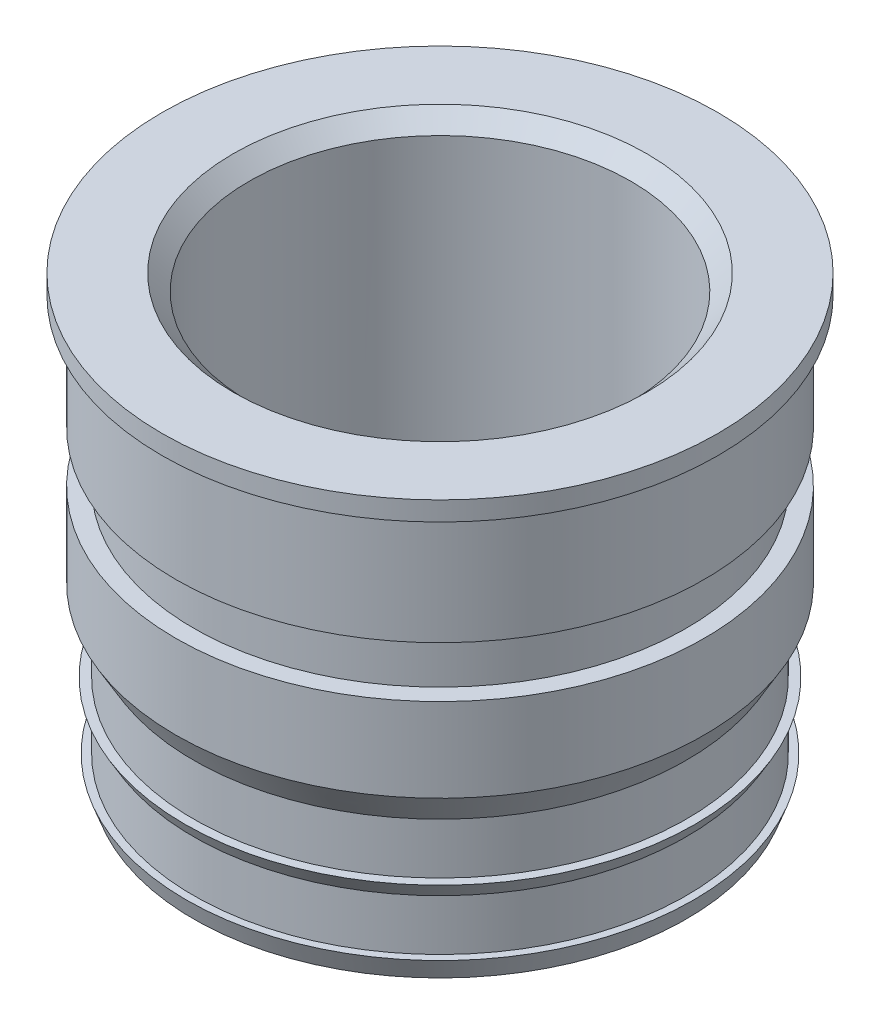
ISO-10303-21;
HEADER;
FILE_DESCRIPTION(('STEP AP214'),'2;1');
FILE_NAME('part.step','',(''),(''),'','','');
FILE_SCHEMA(('AUTOMOTIVE_DESIGN { 1 0 10303 214 1 1 1 1 }'));
ENDSEC;
DATA;
#1=APPLICATION_CONTEXT('core data for automotive mechanical design processes');
#2=APPLICATION_PROTOCOL_DEFINITION('international standard','automotive_design',2000,#1);
#3=PRODUCT_CONTEXT('',#1,'mechanical');
#4=PRODUCT('Part','Part','',(#3));
#5=PRODUCT_RELATED_PRODUCT_CATEGORY('part','',(#4));
#6=PRODUCT_DEFINITION_FORMATION('','',#4);
#7=PRODUCT_DEFINITION_CONTEXT('part definition',#1,'design');
#8=PRODUCT_DEFINITION('design','',#6,#7);
#9=PRODUCT_DEFINITION_SHAPE('','',#8);
#10=(LENGTH_UNIT() NAMED_UNIT(*) SI_UNIT(.MILLI.,.METRE.));
#11=(NAMED_UNIT(*) PLANE_ANGLE_UNIT() SI_UNIT($,.RADIAN.));
#12=(NAMED_UNIT(*) SI_UNIT($,.STERADIAN.) SOLID_ANGLE_UNIT());
#13=UNCERTAINTY_MEASURE_WITH_UNIT(LENGTH_MEASURE(1.E-05),#10,'distance_accuracy_value','');
#14=(GEOMETRIC_REPRESENTATION_CONTEXT(3) GLOBAL_UNCERTAINTY_ASSIGNED_CONTEXT((#13)) GLOBAL_UNIT_ASSIGNED_CONTEXT((#10,
#11,#12)) REPRESENTATION_CONTEXT('',''));
#15=CARTESIAN_POINT('',(0.,0.,0.));
#16=DIRECTION('',(0.,0.,1.));
#17=DIRECTION('',(1.,0.,0.));
#18=AXIS2_PLACEMENT_3D('',#15,#16,#17);
#19=CARTESIAN_POINT('',(0.,1.715,2.185));
#20=DIRECTION('',(0.,-1.,0.));
#21=DIRECTION('',(0.,0.,-1.));
#22=AXIS2_PLACEMENT_3D('',#19,#20,#21);
#23=PLANE('',#22);
#24=CARTESIAN_POINT('',(0.,1.715,0.));
#25=DIRECTION('',(0.,-1.,0.));
#26=DIRECTION('',(0.,0.,-1.));
#27=AXIS2_PLACEMENT_3D('',#24,#25,#26);
#28=CIRCLE('',#27,1.625);
#29=CARTESIAN_POINT('',(0.,1.715,-1.625));
#30=VERTEX_POINT('',#29);
#31=EDGE_CURVE('E10',#30,#30,#28,.T.);
#32=ORIENTED_EDGE('',*,*,#31,.T.);
#33=EDGE_LOOP('',(#32));
#34=FACE_BOUND('',#33,.T.);
#35=CARTESIAN_POINT('',(0.,1.715,0.));
#36=DIRECTION('',(0.,-1.,0.));
#37=DIRECTION('',(0.,0.,-1.));
#38=AXIS2_PLACEMENT_3D('',#35,#36,#37);
#39=CIRCLE('',#38,2.185);
#40=CARTESIAN_POINT('',(0.,1.715,-2.185));
#41=VERTEX_POINT('',#40);
#42=EDGE_CURVE('E112',#41,#41,#39,.T.);
#43=ORIENTED_EDGE('',*,*,#42,.F.);
#44=EDGE_LOOP('',(#43));
#45=FACE_BOUND('',#44,.T.);
#46=ADVANCED_FACE('F50',(#34,#45),#23,.F.);
#47=CARTESIAN_POINT('',(0.,-1.715,0.));
#48=DIRECTION('',(0.,-1.,0.));
#49=DIRECTION('',(0.,0.,-1.));
#50=AXIS2_PLACEMENT_3D('',#47,#48,#49);
#51=CYLINDRICAL_SURFACE('',#50,1.5);
#52=CARTESIAN_POINT('',(0.,-1.59,0.));
#53=DIRECTION('',(0.,1.,0.));
#54=DIRECTION('',(0.,0.,1.));
#55=AXIS2_PLACEMENT_3D('',#52,#53,#54);
#56=CIRCLE('',#55,1.5);
#57=CARTESIAN_POINT('',(0.,-1.59,1.5));
#58=VERTEX_POINT('',#57);
#59=EDGE_CURVE('E59',#58,#58,#56,.F.);
#60=ORIENTED_EDGE('',*,*,#59,.T.);
#61=EDGE_LOOP('',(#60));
#62=FACE_BOUND('',#61,.T.);
#63=CARTESIAN_POINT('',(0.,1.59,0.));
#64=DIRECTION('',(0.,-1.,0.));
#65=DIRECTION('',(0.,0.,-1.));
#66=AXIS2_PLACEMENT_3D('',#63,#64,#65);
#67=CIRCLE('',#66,1.5);
#68=CARTESIAN_POINT('',(0.,1.59,-1.5));
#69=VERTEX_POINT('',#68);
#70=EDGE_CURVE('E61',#69,#69,#67,.F.);
#71=ORIENTED_EDGE('',*,*,#70,.T.);
#72=EDGE_LOOP('',(#71));
#73=FACE_BOUND('',#72,.T.);
#74=ADVANCED_FACE('F125',(#62,#73),#51,.F.);
#75=CARTESIAN_POINT('',(0.,-1.715,1.5));
#76=DIRECTION('',(0.,1.,0.));
#77=DIRECTION('',(0.,0.,1.));
#78=AXIS2_PLACEMENT_3D('',#75,#76,#77);
#79=PLANE('',#78);
#80=CARTESIAN_POINT('',(0.,-1.715,0.));
#81=DIRECTION('',(0.,1.,0.));
#82=DIRECTION('',(0.,0.,1.));
#83=AXIS2_PLACEMENT_3D('',#80,#81,#82);
#84=CIRCLE('',#83,1.625);
#85=CARTESIAN_POINT('',(0.,-1.715,1.625));
#86=VERTEX_POINT('',#85);
#87=EDGE_CURVE('E53',#86,#86,#84,.T.);
#88=ORIENTED_EDGE('',*,*,#87,.T.);
#89=EDGE_LOOP('',(#88));
#90=FACE_BOUND('',#89,.T.);
#91=CARTESIAN_POINT('',(0.,-1.715,0.));
#92=DIRECTION('',(0.,-1.,0.));
#93=DIRECTION('',(0.,0.,-1.));
#94=AXIS2_PLACEMENT_3D('',#91,#92,#93);
#95=CIRCLE('',#94,1.9368932038835);
#96=CARTESIAN_POINT('',(0.,-1.715,-1.9368932038835));
#97=VERTEX_POINT('',#96);
#98=EDGE_CURVE('E70',#97,#97,#95,.T.);
#99=ORIENTED_EDGE('',*,*,#98,.T.);
#100=EDGE_LOOP('',(#99));
#101=FACE_BOUND('',#100,.T.);
#102=ADVANCED_FACE('F128',(#90,#101),#79,.F.);
#103=CARTESIAN_POINT('',(0.,-1.55535288975305,0.));
#104=DIRECTION('',(0.,1.,0.));
#105=DIRECTION('',(0.,0.,1.));
#106=AXIS2_PLACEMENT_3D('',#103,#104,#105);
#107=CONICAL_SURFACE('',#106,1.995,0.34906585039886);
#108=ORIENTED_EDGE('',*,*,#98,.F.);
#109=EDGE_LOOP('',(#108));
#110=FACE_BOUND('',#109,.T.);
#111=CARTESIAN_POINT('',(0.,-1.55535288975305,0.));
#112=DIRECTION('',(0.,-1.,0.));
#113=DIRECTION('',(0.,0.,-1.));
#114=AXIS2_PLACEMENT_3D('',#111,#112,#113);
#115=CIRCLE('',#114,1.995);
#116=CARTESIAN_POINT('',(0.,-1.55535288975305,-1.995));
#117=VERTEX_POINT('',#116);
#118=EDGE_CURVE('E69',#117,#117,#115,.T.);
#119=ORIENTED_EDGE('',*,*,#118,.T.);
#120=EDGE_LOOP('',(#119));
#121=FACE_BOUND('',#120,.T.);
#122=ADVANCED_FACE('F210',(#110,#121),#107,.T.);
#123=CARTESIAN_POINT('',(0.,-1.55535288975305,1.995));
#124=DIRECTION('',(0.,-1.,0.));
#125=DIRECTION('',(0.,0.,-1.));
#126=AXIS2_PLACEMENT_3D('',#123,#124,#125);
#127=PLANE('',#126);
#128=ORIENTED_EDGE('',*,*,#118,.F.);
#129=EDGE_LOOP('',(#128));
#130=FACE_BOUND('',#129,.T.);
#131=CARTESIAN_POINT('',(0.,-1.55535288975305,0.));
#132=DIRECTION('',(0.,-1.,0.));
#133=DIRECTION('',(0.,0.,-1.));
#134=AXIS2_PLACEMENT_3D('',#131,#132,#133);
#135=CIRCLE('',#134,1.9368932038835);
#136=CARTESIAN_POINT('',(0.,-1.55535288975305,-1.9368932038835));
#137=VERTEX_POINT('',#136);
#138=EDGE_CURVE('E75',#137,#137,#135,.T.);
#139=ORIENTED_EDGE('',*,*,#138,.T.);
#140=EDGE_LOOP('',(#139));
#141=FACE_BOUND('',#140,.T.);
#142=ADVANCED_FACE('F202',(#130,#141),#127,.F.);
#143=CARTESIAN_POINT('',(0.,-1.715,0.));
#144=DIRECTION('',(0.,-1.,0.));
#145=DIRECTION('',(0.,0.,-1.));
#146=AXIS2_PLACEMENT_3D('',#143,#144,#145);
#147=CYLINDRICAL_SURFACE('',#146,1.9368932038835);
#148=ORIENTED_EDGE('',*,*,#138,.F.);
#149=EDGE_LOOP('',(#148));
#150=FACE_BOUND('',#149,.T.);
#151=CARTESIAN_POINT('',(0.,-1.15486877276038,0.));
#152=DIRECTION('',(0.,-1.,0.));
#153=DIRECTION('',(0.,0.,-1.));
#154=AXIS2_PLACEMENT_3D('',#151,#152,#153);
#155=CIRCLE('',#154,1.9368932038835);
#156=CARTESIAN_POINT('',(0.,-1.15486877276038,-1.9368932038835));
#157=VERTEX_POINT('',#156);
#158=EDGE_CURVE('E76',#157,#157,#155,.T.);
#159=ORIENTED_EDGE('',*,*,#158,.T.);
#160=EDGE_LOOP('',(#159));
#161=FACE_BOUND('',#160,.T.);
#162=ADVANCED_FACE('F197',(#150,#161),#147,.T.);
#163=CARTESIAN_POINT('',(0.,-1.03461525983536,0.));
#164=DIRECTION('',(0.,1.,0.));
#165=DIRECTION('',(0.,0.,1.));
#166=AXIS2_PLACEMENT_3D('',#163,#164,#165);
#167=CONICAL_SURFACE('',#166,2.00632160194175,0.523598775598289);
#168=ORIENTED_EDGE('',*,*,#158,.F.);
#169=EDGE_LOOP('',(#168));
#170=FACE_BOUND('',#169,.T.);
#171=CARTESIAN_POINT('',(0.,-1.03461525983536,0.));
#172=DIRECTION('',(0.,-1.,0.));
#173=DIRECTION('',(0.,0.,-1.));
#174=AXIS2_PLACEMENT_3D('',#171,#172,#173);
#175=CIRCLE('',#174,2.00632160194175);
#176=CARTESIAN_POINT('',(0.,-1.03461525983536,-2.00632160194175));
#177=VERTEX_POINT('',#176);
#178=EDGE_CURVE('E77',#177,#177,#175,.T.);
#179=ORIENTED_EDGE('',*,*,#178,.T.);
#180=EDGE_LOOP('',(#179));
#181=FACE_BOUND('',#180,.T.);
#182=ADVANCED_FACE('F194',(#170,#181),#167,.T.);
#183=CARTESIAN_POINT('',(0.,-1.03461525983536,2.00632160194175));
#184=DIRECTION('',(0.,-1.,0.));
#185=DIRECTION('',(0.,0.,-1.));
#186=AXIS2_PLACEMENT_3D('',#183,#184,#185);
#187=PLANE('',#186);
#188=ORIENTED_EDGE('',*,*,#178,.F.);
#189=EDGE_LOOP('',(#188));
#190=FACE_BOUND('',#189,.T.);
#191=CARTESIAN_POINT('',(0.,-1.03461525983536,0.));
#192=DIRECTION('',(0.,-1.,0.));
#193=DIRECTION('',(0.,0.,-1.));
#194=AXIS2_PLACEMENT_3D('',#191,#192,#193);
#195=CIRCLE('',#194,1.9368932038835);
#196=CARTESIAN_POINT('',(0.,-1.03461525983536,-1.9368932038835));
#197=VERTEX_POINT('',#196);
#198=EDGE_CURVE('E85',#197,#197,#195,.T.);
#199=ORIENTED_EDGE('',*,*,#198,.T.);
#200=EDGE_LOOP('',(#199));
#201=FACE_BOUND('',#200,.T.);
#202=ADVANCED_FACE('F191',(#190,#201),#187,.F.);
#203=CARTESIAN_POINT('',(0.,-1.715,0.));
#204=DIRECTION('',(0.,-1.,0.));
#205=DIRECTION('',(0.,0.,-1.));
#206=AXIS2_PLACEMENT_3D('',#203,#204,#205);
#207=CYLINDRICAL_SURFACE('',#206,1.9368932038835);
#208=ORIENTED_EDGE('',*,*,#198,.F.);
#209=EDGE_LOOP('',(#208));
#210=FACE_BOUND('',#209,.T.);
#211=CARTESIAN_POINT('',(0.,-0.634131142842693,0.));
#212=DIRECTION('',(0.,-1.,0.));
#213=DIRECTION('',(0.,0.,-1.));
#214=AXIS2_PLACEMENT_3D('',#211,#212,#213);
#215=CIRCLE('',#214,1.9368932038835);
#216=CARTESIAN_POINT('',(0.,-0.634131142842693,-1.9368932038835));
#217=VERTEX_POINT('',#216);
#218=EDGE_CURVE('E83',#217,#217,#215,.T.);
#219=ORIENTED_EDGE('',*,*,#218,.T.);
#220=EDGE_LOOP('',(#219));
#221=FACE_BOUND('',#220,.T.);
#222=ADVANCED_FACE('F190',(#210,#221),#207,.T.);
#223=CARTESIAN_POINT('',(0.,-0.393624116992671,0.));
#224=DIRECTION('',(0.,1.,0.));
#225=DIRECTION('',(0.,0.,1.));
#226=AXIS2_PLACEMENT_3D('',#223,#224,#225);
#227=CONICAL_SURFACE('',#226,2.07575,0.523598775598293);
#228=ORIENTED_EDGE('',*,*,#218,.F.);
#229=EDGE_LOOP('',(#228));
#230=FACE_BOUND('',#229,.T.);
#231=CARTESIAN_POINT('',(0.,-0.393624116992671,0.));
#232=DIRECTION('',(0.,-1.,0.));
#233=DIRECTION('',(0.,0.,-1.));
#234=AXIS2_PLACEMENT_3D('',#231,#232,#233);
#235=CIRCLE('',#234,2.07575);
#236=CARTESIAN_POINT('',(0.,-0.393624116992671,-2.07575));
#237=VERTEX_POINT('',#236);
#238=EDGE_CURVE('E90',#237,#237,#235,.T.);
#239=ORIENTED_EDGE('',*,*,#238,.T.);
#240=EDGE_LOOP('',(#239));
#241=FACE_BOUND('',#240,.T.);
#242=ADVANCED_FACE('F181',(#230,#241),#227,.T.);
#243=CARTESIAN_POINT('',(0.,-1.715,0.));
#244=DIRECTION('',(0.,-1.,0.));
#245=DIRECTION('',(0.,0.,-1.));
#246=AXIS2_PLACEMENT_3D('',#243,#244,#245);
#247=CYLINDRICAL_SURFACE('',#246,2.07575);
#248=ORIENTED_EDGE('',*,*,#238,.F.);
#249=EDGE_LOOP('',(#248));
#250=FACE_BOUND('',#249,.T.);
#251=CARTESIAN_POINT('',(0.,0.264935883007329,0.));
#252=DIRECTION('',(0.,-1.,0.));
#253=DIRECTION('',(0.,0.,-1.));
#254=AXIS2_PLACEMENT_3D('',#251,#252,#253);
#255=CIRCLE('',#254,2.07575);
#256=CARTESIAN_POINT('',(0.,0.264935883007329,-2.07575));
#257=VERTEX_POINT('',#256);
#258=EDGE_CURVE('E91',#257,#257,#255,.T.);
#259=ORIENTED_EDGE('',*,*,#258,.T.);
#260=EDGE_LOOP('',(#259));
#261=FACE_BOUND('',#260,.T.);
#262=ADVANCED_FACE('F177',(#250,#261),#247,.T.);
#263=CARTESIAN_POINT('',(0.,0.264935883007329,2.07575));
#264=DIRECTION('',(0.,-1.,0.));
#265=DIRECTION('',(0.,0.,-1.));
#266=AXIS2_PLACEMENT_3D('',#263,#264,#265);
#267=PLANE('',#266);
#268=ORIENTED_EDGE('',*,*,#258,.F.);
#269=EDGE_LOOP('',(#268));
#270=FACE_BOUND('',#269,.T.);
#271=CARTESIAN_POINT('',(0.,0.264935883007329,0.));
#272=DIRECTION('',(0.,-1.,0.));
#273=DIRECTION('',(0.,0.,-1.));
#274=AXIS2_PLACEMENT_3D('',#271,#272,#273);
#275=CIRCLE('',#274,1.9368932038835);
#276=CARTESIAN_POINT('',(0.,0.264935883007329,-1.9368932038835));
#277=VERTEX_POINT('',#276);
#278=EDGE_CURVE('E93',#277,#277,#275,.T.);
#279=ORIENTED_EDGE('',*,*,#278,.T.);
#280=EDGE_LOOP('',(#279));
#281=FACE_BOUND('',#280,.T.);
#282=ADVANCED_FACE('F173',(#270,#281),#267,.F.);
#283=CARTESIAN_POINT('',(0.,-1.715,0.));
#284=DIRECTION('',(0.,-1.,0.));
#285=DIRECTION('',(0.,0.,-1.));
#286=AXIS2_PLACEMENT_3D('',#283,#284,#285);
#287=CYLINDRICAL_SURFACE('',#286,1.9368932038835);
#288=ORIENTED_EDGE('',*,*,#278,.F.);
#289=EDGE_LOOP('',(#288));
#290=FACE_BOUND('',#289,.T.);
#291=CARTESIAN_POINT('',(0.,0.66542,0.));
#292=DIRECTION('',(0.,-1.,0.));
#293=DIRECTION('',(0.,0.,-1.));
#294=AXIS2_PLACEMENT_3D('',#291,#292,#293);
#295=CIRCLE('',#294,1.9368932038835);
#296=CARTESIAN_POINT('',(0.,0.66542,-1.9368932038835));
#297=VERTEX_POINT('',#296);
#298=EDGE_CURVE('E99',#297,#297,#295,.T.);
#299=ORIENTED_EDGE('',*,*,#298,.T.);
#300=EDGE_LOOP('',(#299));
#301=FACE_BOUND('',#300,.T.);
#302=ADVANCED_FACE('F172',(#290,#301),#287,.T.);
#303=CARTESIAN_POINT('',(0.,0.66542,1.9368932038835));
#304=DIRECTION('',(0.,1.,0.));
#305=DIRECTION('',(0.,0.,1.));
#306=AXIS2_PLACEMENT_3D('',#303,#304,#305);
#307=PLANE('',#306);
#308=ORIENTED_EDGE('',*,*,#298,.F.);
#309=EDGE_LOOP('',(#308));
#310=FACE_BOUND('',#309,.T.);
#311=CARTESIAN_POINT('',(0.,0.665419999999999,0.));
#312=DIRECTION('',(0.,-1.,0.));
#313=DIRECTION('',(0.,0.,-1.));
#314=AXIS2_PLACEMENT_3D('',#311,#312,#313);
#315=CIRCLE('',#314,2.07575);
#316=CARTESIAN_POINT('',(0.,0.665419999999999,-2.07575));
#317=VERTEX_POINT('',#316);
#318=EDGE_CURVE('E98',#317,#317,#315,.T.);
#319=ORIENTED_EDGE('',*,*,#318,.T.);
#320=EDGE_LOOP('',(#319));
#321=FACE_BOUND('',#320,.T.);
#322=ADVANCED_FACE('F170',(#310,#321),#307,.F.);
#323=CARTESIAN_POINT('',(0.,-1.715,0.));
#324=DIRECTION('',(0.,-1.,0.));
#325=DIRECTION('',(0.,0.,-1.));
#326=AXIS2_PLACEMENT_3D('',#323,#324,#325);
#327=CYLINDRICAL_SURFACE('',#326,2.07575);
#328=ORIENTED_EDGE('',*,*,#318,.F.);
#329=EDGE_LOOP('',(#328));
#330=FACE_BOUND('',#329,.T.);
#331=CARTESIAN_POINT('',(0.,1.48862,0.));
#332=DIRECTION('',(0.,-1.,0.));
#333=DIRECTION('',(0.,0.,-1.));
#334=AXIS2_PLACEMENT_3D('',#331,#332,#333);
#335=CIRCLE('',#334,2.07575);
#336=CARTESIAN_POINT('',(0.,1.48862,-2.07575));
#337=VERTEX_POINT('',#336);
#338=EDGE_CURVE('E103',#337,#337,#335,.T.);
#339=ORIENTED_EDGE('',*,*,#338,.T.);
#340=EDGE_LOOP('',(#339));
#341=FACE_BOUND('',#340,.T.);
#342=ADVANCED_FACE('F165',(#330,#341),#327,.T.);
#343=CARTESIAN_POINT('',(0.,1.48862,1.8425));
#344=DIRECTION('',(0.,-1.,0.));
#345=DIRECTION('',(0.,0.,-1.));
#346=AXIS2_PLACEMENT_3D('',#343,#344,#345);
#347=PLANE('',#346);
#348=ORIENTED_EDGE('',*,*,#338,.F.);
#349=EDGE_LOOP('',(#348));
#350=FACE_BOUND('',#349,.T.);
#351=CARTESIAN_POINT('',(0.,1.48862,0.));
#352=DIRECTION('',(0.,-1.,0.));
#353=DIRECTION('',(0.,0.,-1.));
#354=AXIS2_PLACEMENT_3D('',#351,#352,#353);
#355=CIRCLE('',#354,1.8425);
#356=CARTESIAN_POINT('',(0.,1.48862,-1.8425));
#357=VERTEX_POINT('',#356);
#358=EDGE_CURVE('E108',#357,#357,#355,.T.);
#359=ORIENTED_EDGE('',*,*,#358,.T.);
#360=EDGE_LOOP('',(#359));
#361=FACE_BOUND('',#360,.T.);
#362=ADVANCED_FACE('F159',(#350,#361),#347,.F.);
#363=CARTESIAN_POINT('',(0.,-1.715,0.));
#364=DIRECTION('',(0.,-1.,0.));
#365=DIRECTION('',(0.,0.,-1.));
#366=AXIS2_PLACEMENT_3D('',#363,#364,#365);
#367=CYLINDRICAL_SURFACE('',#366,1.8425);
#368=ORIENTED_EDGE('',*,*,#358,.F.);
#369=EDGE_LOOP('',(#368));
#370=FACE_BOUND('',#369,.T.);
#371=CARTESIAN_POINT('',(0.,1.56408,0.));
#372=DIRECTION('',(0.,-1.,0.));
#373=DIRECTION('',(0.,0.,-1.));
#374=AXIS2_PLACEMENT_3D('',#371,#372,#373);
#375=CIRCLE('',#374,1.8425);
#376=CARTESIAN_POINT('',(0.,1.56408,-1.8425));
#377=VERTEX_POINT('',#376);
#378=EDGE_CURVE('E110',#377,#377,#375,.T.);
#379=ORIENTED_EDGE('',*,*,#378,.T.);
#380=EDGE_LOOP('',(#379));
#381=FACE_BOUND('',#380,.T.);
#382=ADVANCED_FACE('F155',(#370,#381),#367,.T.);
#383=CARTESIAN_POINT('',(0.,1.56408,1.8425));
#384=DIRECTION('',(0.,1.,0.));
#385=DIRECTION('',(0.,0.,1.));
#386=AXIS2_PLACEMENT_3D('',#383,#384,#385);
#387=PLANE('',#386);
#388=ORIENTED_EDGE('',*,*,#378,.F.);
#389=EDGE_LOOP('',(#388));
#390=FACE_BOUND('',#389,.T.);
#391=CARTESIAN_POINT('',(0.,1.56408,0.));
#392=DIRECTION('',(0.,-1.,0.));
#393=DIRECTION('',(0.,0.,-1.));
#394=AXIS2_PLACEMENT_3D('',#391,#392,#393);
#395=CIRCLE('',#394,2.185);
#396=CARTESIAN_POINT('',(0.,1.56408,-2.185));
#397=VERTEX_POINT('',#396);
#398=EDGE_CURVE('E115',#397,#397,#395,.T.);
#399=ORIENTED_EDGE('',*,*,#398,.T.);
#400=EDGE_LOOP('',(#399));
#401=FACE_BOUND('',#400,.T.);
#402=ADVANCED_FACE('F141',(#390,#401),#387,.F.);
#403=CARTESIAN_POINT('',(0.,-1.715,0.));
#404=DIRECTION('',(0.,-1.,0.));
#405=DIRECTION('',(0.,0.,-1.));
#406=AXIS2_PLACEMENT_3D('',#403,#404,#405);
#407=CYLINDRICAL_SURFACE('',#406,2.185);
#408=ORIENTED_EDGE('',*,*,#398,.F.);
#409=EDGE_LOOP('',(#408));
#410=FACE_BOUND('',#409,.T.);
#411=ORIENTED_EDGE('',*,*,#42,.T.);
#412=EDGE_LOOP('',(#411));
#413=FACE_BOUND('',#412,.T.);
#414=ADVANCED_FACE('F117',(#410,#413),#407,.T.);
#415=CARTESIAN_POINT('',(0.,-1.59,0.));
#416=DIRECTION('',(0.,-1.,0.));
#417=DIRECTION('',(0.,0.,-1.));
#418=AXIS2_PLACEMENT_3D('',#415,#416,#417);
#419=CONICAL_SURFACE('',#418,1.5,0.785398163397448);
#420=ORIENTED_EDGE('',*,*,#87,.F.);
#421=EDGE_LOOP('',(#420));
#422=FACE_BOUND('',#421,.T.);
#423=ORIENTED_EDGE('',*,*,#59,.F.);
#424=EDGE_LOOP('',(#423));
#425=FACE_BOUND('',#424,.T.);
#426=ADVANCED_FACE('F134',(#422,#425),#419,.F.);
#427=CARTESIAN_POINT('',(0.,1.715,0.));
#428=DIRECTION('',(0.,1.,0.));
#429=DIRECTION('',(0.,0.,1.));
#430=AXIS2_PLACEMENT_3D('',#427,#428,#429);
#431=CONICAL_SURFACE('',#430,1.625,0.785398163397447);
#432=ORIENTED_EDGE('',*,*,#70,.F.);
#433=EDGE_LOOP('',(#432));
#434=FACE_BOUND('',#433,.T.);
#435=ORIENTED_EDGE('',*,*,#31,.F.);
#436=EDGE_LOOP('',(#435));
#437=FACE_BOUND('',#436,.T.);
#438=ADVANCED_FACE('F47',(#434,#437),#431,.F.);
#439=CLOSED_SHELL('',(#46,#74,#102,#122,#142,#162,#182,#202,#222,#242,#262,#282,#302,#322,#342,
#362,#382,#402,#414,#426,#438));
#440=MANIFOLD_SOLID_BREP('B2',#439);
#441=ADVANCED_BREP_SHAPE_REPRESENTATION('',(#18,#440),#14);
#442=SHAPE_DEFINITION_REPRESENTATION(#9,#441);
ENDSEC;
END-ISO-10303-21;
